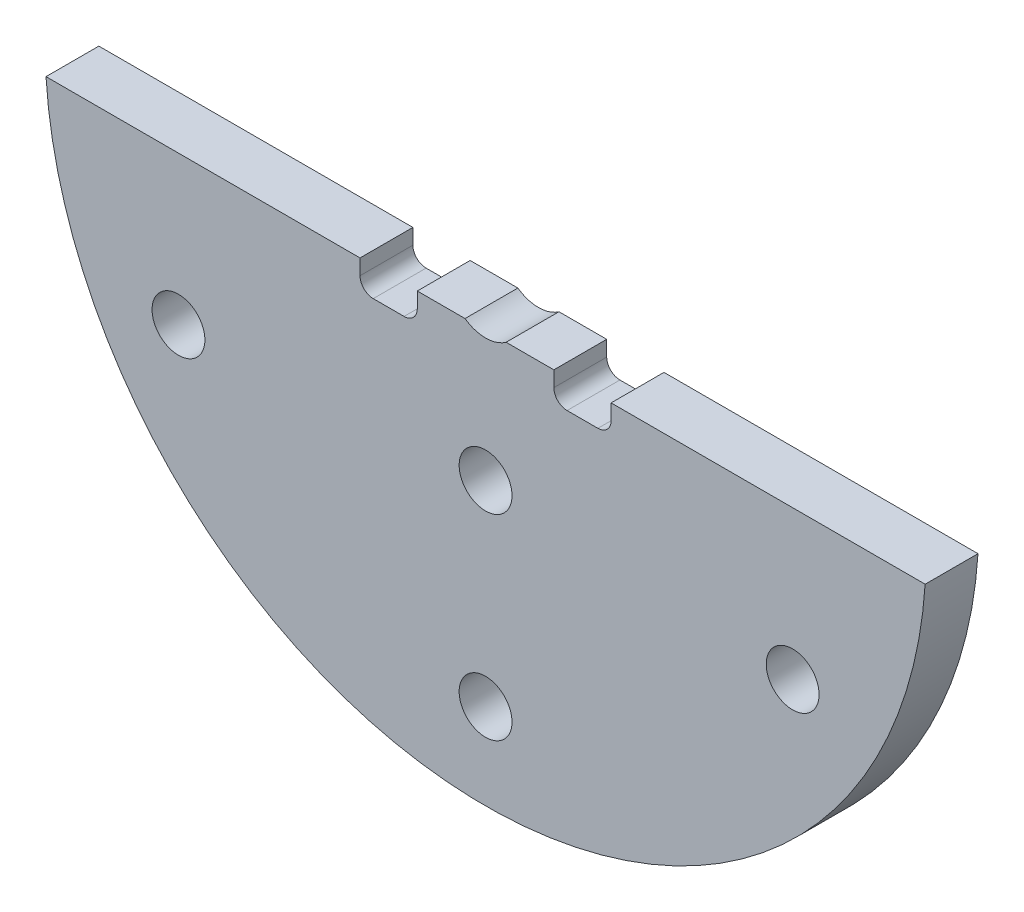
ISO-10303-21;
HEADER;
FILE_DESCRIPTION(('STEP AP214'),'2;1');
FILE_NAME('part.step','',(''),(''),'','','');
FILE_SCHEMA(('AUTOMOTIVE_DESIGN { 1 0 10303 214 1 1 1 1 }'));
ENDSEC;
DATA;
#1=APPLICATION_CONTEXT('core data for automotive mechanical design processes');
#2=APPLICATION_PROTOCOL_DEFINITION('international standard','automotive_design',2000,#1);
#3=PRODUCT_CONTEXT('',#1,'mechanical');
#4=PRODUCT('Part','Part','',(#3));
#5=PRODUCT_RELATED_PRODUCT_CATEGORY('part','',(#4));
#6=PRODUCT_DEFINITION_FORMATION('','',#4);
#7=PRODUCT_DEFINITION_CONTEXT('part definition',#1,'design');
#8=PRODUCT_DEFINITION('design','',#6,#7);
#9=PRODUCT_DEFINITION_SHAPE('','',#8);
#10=(LENGTH_UNIT() NAMED_UNIT(*) SI_UNIT(.MILLI.,.METRE.));
#11=(NAMED_UNIT(*) PLANE_ANGLE_UNIT() SI_UNIT($,.RADIAN.));
#12=(NAMED_UNIT(*) SI_UNIT($,.STERADIAN.) SOLID_ANGLE_UNIT());
#13=UNCERTAINTY_MEASURE_WITH_UNIT(LENGTH_MEASURE(1.E-05),#10,'distance_accuracy_value','');
#14=(GEOMETRIC_REPRESENTATION_CONTEXT(3) GLOBAL_UNCERTAINTY_ASSIGNED_CONTEXT((#13)) GLOBAL_UNIT_ASSIGNED_CONTEXT((#10,
#11,#12)) REPRESENTATION_CONTEXT('',''));
#15=CARTESIAN_POINT('',(0.,0.,0.));
#16=DIRECTION('',(0.,0.,1.));
#17=DIRECTION('',(1.,0.,0.));
#18=AXIS2_PLACEMENT_3D('',#15,#16,#17);
#19=CARTESIAN_POINT('',(190.230949351342,190.589281636706,3.));
#20=DIRECTION('',(0.,0.,1.));
#21=DIRECTION('',(1.,0.,0.));
#22=AXIS2_PLACEMENT_3D('',#19,#20,#21);
#23=PLANE('',#22);
#24=CARTESIAN_POINT('',(207.6593744092,180.5269757379,3.));
#25=DIRECTION('',(0.,0.,1.));
#26=DIRECTION('',(1.,0.,0.));
#27=AXIS2_PLACEMENT_3D('',#24,#25,#26);
#28=CIRCLE('',#27,1.5);
#29=CARTESIAN_POINT('',(209.1593744092,180.5269757379,3.));
#30=VERTEX_POINT('',#29);
#31=EDGE_CURVE('E517',#30,#30,#28,.T.);
#32=ORIENTED_EDGE('',*,*,#31,.F.);
#33=EDGE_LOOP('',(#32));
#34=FACE_BOUND('',#33,.T.);
#35=CARTESIAN_POINT('',(172.8025242934,180.5269757379,3.));
#36=DIRECTION('',(0.,0.,1.));
#37=DIRECTION('',(1.,0.,0.));
#38=AXIS2_PLACEMENT_3D('',#35,#36,#37);
#39=CIRCLE('',#38,1.5);
#40=CARTESIAN_POINT('',(174.3025242934,180.5269757379,3.));
#41=VERTEX_POINT('',#40);
#42=EDGE_CURVE('E180',#41,#41,#39,.T.);
#43=ORIENTED_EDGE('',*,*,#42,.F.);
#44=EDGE_LOOP('',(#43));
#45=FACE_BOUND('',#44,.T.);
#46=CARTESIAN_POINT('',(190.230949351342,190.589281636706,3.));
#47=DIRECTION('',(0.,0.,1.));
#48=DIRECTION('',(1.,0.,0.));
#49=AXIS2_PLACEMENT_3D('',#46,#47,#48);
#50=CIRCLE('',#49,25.);
#51=CARTESIAN_POINT('',(165.2838177527,188.9642816367,3.));
#52=VERTEX_POINT('',#51);
#53=CARTESIAN_POINT('',(215.1780809499,188.9642816367,3.));
#54=VERTEX_POINT('',#53);
#55=EDGE_CURVE('E116',#52,#54,#50,.T.);
#56=ORIENTED_EDGE('',*,*,#55,.T.);
#57=DIRECTION('',(-1.,0.,0.));
#58=VECTOR('',#57,1.);
#59=CARTESIAN_POINT('',(197.3559493513,188.9642816367,3.));
#60=LINE('',#59,#58);
#61=CARTESIAN_POINT('',(197.3559493513,188.9642816367,3.));
#62=VERTEX_POINT('',#61);
#63=EDGE_CURVE('E297',#54,#62,#60,.T.);
#64=ORIENTED_EDGE('',*,*,#63,.T.);
#65=DIRECTION('',(0.,-1.,0.));
#66=VECTOR('',#65,1.);
#67=CARTESIAN_POINT('',(197.3559493513,188.0892816367,3.));
#68=LINE('',#67,#66);
#69=CARTESIAN_POINT('',(197.3559493513,188.0892816367,3.));
#70=VERTEX_POINT('',#69);
#71=EDGE_CURVE('E248',#62,#70,#68,.T.);
#72=ORIENTED_EDGE('',*,*,#71,.T.);
#73=CARTESIAN_POINT('',(196.6059493513,188.0892816367,3.));
#74=DIRECTION('',(0.,0.,-1.));
#75=DIRECTION('',(1.,0.,0.));
#76=AXIS2_PLACEMENT_3D('',#73,#74,#75);
#77=CIRCLE('',#76,0.750000000000237);
#78=CARTESIAN_POINT('',(196.6059493513,187.3392816367,3.));
#79=VERTEX_POINT('',#78);
#80=EDGE_CURVE('E267',#70,#79,#77,.T.);
#81=ORIENTED_EDGE('',*,*,#80,.T.);
#82=DIRECTION('',(-1.,0.,0.));
#83=VECTOR('',#82,1.);
#84=CARTESIAN_POINT('',(194.8559493513,187.3392816367,3.));
#85=LINE('',#84,#83);
#86=CARTESIAN_POINT('',(194.8559493513,187.3392816367,3.));
#87=VERTEX_POINT('',#86);
#88=EDGE_CURVE('E264',#79,#87,#85,.T.);
#89=ORIENTED_EDGE('',*,*,#88,.T.);
#90=CARTESIAN_POINT('',(194.8559493513,188.0892816367,3.));
#91=DIRECTION('',(0.,0.,-1.));
#92=DIRECTION('',(1.,0.,0.));
#93=AXIS2_PLACEMENT_3D('',#90,#91,#92);
#94=CIRCLE('',#93,0.750000000000001);
#95=CARTESIAN_POINT('',(194.1059493513,188.0892816367,3.));
#96=VERTEX_POINT('',#95);
#97=EDGE_CURVE('E266',#87,#96,#94,.T.);
#98=ORIENTED_EDGE('',*,*,#97,.T.);
#99=DIRECTION('',(0.,1.,0.));
#100=VECTOR('',#99,1.);
#101=CARTESIAN_POINT('',(194.1059493513,188.9642816367,3.));
#102=LINE('',#101,#100);
#103=CARTESIAN_POINT('',(194.1059493513,188.9642816367,3.));
#104=VERTEX_POINT('',#103);
#105=EDGE_CURVE('E269',#96,#104,#102,.T.);
#106=ORIENTED_EDGE('',*,*,#105,.T.);
#107=DIRECTION('',(-1.,0.,0.));
#108=VECTOR('',#107,1.);
#109=CARTESIAN_POINT('',(191.3968717329,188.9642816367,3.));
#110=LINE('',#109,#108);
#111=CARTESIAN_POINT('',(191.396871732914,188.96428163668,3.));
#112=VERTEX_POINT('',#111);
#113=EDGE_CURVE('E275',#104,#112,#110,.T.);
#114=ORIENTED_EDGE('',*,*,#113,.T.);
#115=CARTESIAN_POINT('',(190.230949351342,190.589281636706,3.));
#116=DIRECTION('',(0.,0.,-1.));
#117=DIRECTION('',(1.,0.,0.));
#118=AXIS2_PLACEMENT_3D('',#115,#116,#117);
#119=CIRCLE('',#118,1.99999999998351);
#120=CARTESIAN_POINT('',(189.0650269697,188.9642816367,3.));
#121=VERTEX_POINT('',#120);
#122=EDGE_CURVE('E277',#112,#121,#119,.T.);
#123=ORIENTED_EDGE('',*,*,#122,.T.);
#124=DIRECTION('',(-1.,0.,0.));
#125=VECTOR('',#124,1.);
#126=CARTESIAN_POINT('',(186.3559493513,188.9642816367,3.));
#127=LINE('',#126,#125);
#128=CARTESIAN_POINT('',(186.3559493513,188.9642816367,3.));
#129=VERTEX_POINT('',#128);
#130=EDGE_CURVE('E279',#121,#129,#127,.T.);
#131=ORIENTED_EDGE('',*,*,#130,.T.);
#132=DIRECTION('',(0.,-1.,0.));
#133=VECTOR('',#132,1.);
#134=CARTESIAN_POINT('',(186.3559493513,188.9642816367,3.));
#135=LINE('',#134,#133);
#136=CARTESIAN_POINT('',(186.3559493513,188.0892816367,3.));
#137=VERTEX_POINT('',#136);
#138=EDGE_CURVE('E281',#129,#137,#135,.T.);
#139=ORIENTED_EDGE('',*,*,#138,.T.);
#140=CARTESIAN_POINT('',(185.6059493513,188.0892816367,3.));
#141=DIRECTION('',(0.,0.,-1.));
#142=DIRECTION('',(1.,0.,0.));
#143=AXIS2_PLACEMENT_3D('',#140,#141,#142);
#144=CIRCLE('',#143,0.750000000000001);
#145=CARTESIAN_POINT('',(185.6059493513,187.3392816367,3.));
#146=VERTEX_POINT('',#145);
#147=EDGE_CURVE('E283',#137,#146,#144,.T.);
#148=ORIENTED_EDGE('',*,*,#147,.T.);
#149=DIRECTION('',(-1.,0.,0.));
#150=VECTOR('',#149,1.);
#151=CARTESIAN_POINT('',(185.6059493513,187.3392816367,3.));
#152=LINE('',#151,#150);
#153=CARTESIAN_POINT('',(183.8559493513,187.3392816367,3.));
#154=VERTEX_POINT('',#153);
#155=EDGE_CURVE('E160',#146,#154,#152,.T.);
#156=ORIENTED_EDGE('',*,*,#155,.T.);
#157=CARTESIAN_POINT('',(183.8559493513,188.0892816367,3.));
#158=DIRECTION('',(0.,0.,-1.));
#159=DIRECTION('',(1.,0.,0.));
#160=AXIS2_PLACEMENT_3D('',#157,#158,#159);
#161=CIRCLE('',#160,0.750000000000001);
#162=CARTESIAN_POINT('',(183.1059493513,188.0892816367,3.));
#163=VERTEX_POINT('',#162);
#164=EDGE_CURVE('E154',#154,#163,#161,.T.);
#165=ORIENTED_EDGE('',*,*,#164,.T.);
#166=DIRECTION('',(0.,1.,0.));
#167=VECTOR('',#166,1.);
#168=CARTESIAN_POINT('',(183.1059493513,188.0892816367,3.));
#169=LINE('',#168,#167);
#170=CARTESIAN_POINT('',(183.1059493513,188.9642816367,3.));
#171=VERTEX_POINT('',#170);
#172=EDGE_CURVE('E158',#163,#171,#169,.T.);
#173=ORIENTED_EDGE('',*,*,#172,.T.);
#174=DIRECTION('',(-1.,0.,0.));
#175=VECTOR('',#174,1.);
#176=CARTESIAN_POINT('',(165.2838177527,188.9642816367,3.));
#177=LINE('',#176,#175);
#178=EDGE_CURVE('E50',#171,#52,#177,.T.);
#179=ORIENTED_EDGE('',*,*,#178,.T.);
#180=EDGE_LOOP('',(#56,#64,#72,#81,#89,#98,#106,#114,#123,#131,#139,#148,#156,#165,#173,#179));
#181=FACE_BOUND('',#180,.T.);
#182=CARTESIAN_POINT('',(190.2309493513,170.4646698392,3.));
#183=DIRECTION('',(0.,0.,1.));
#184=DIRECTION('',(1.,0.,0.));
#185=AXIS2_PLACEMENT_3D('',#182,#183,#184);
#186=CIRCLE('',#185,1.5);
#187=CARTESIAN_POINT('',(191.7309493513,170.4646698392,3.));
#188=VERTEX_POINT('',#187);
#189=EDGE_CURVE('E523',#188,#188,#186,.T.);
#190=ORIENTED_EDGE('',*,*,#189,.F.);
#191=EDGE_LOOP('',(#190));
#192=FACE_BOUND('',#191,.T.);
#193=CARTESIAN_POINT('',(190.2309493513,181.5892816367,3.));
#194=DIRECTION('',(0.,0.,1.));
#195=DIRECTION('',(1.,0.,0.));
#196=AXIS2_PLACEMENT_3D('',#193,#194,#195);
#197=CIRCLE('',#196,1.5);
#198=CARTESIAN_POINT('',(191.7309493513,181.5892816367,3.));
#199=VERTEX_POINT('',#198);
#200=EDGE_CURVE('E508',#199,#199,#197,.T.);
#201=ORIENTED_EDGE('',*,*,#200,.F.);
#202=EDGE_LOOP('',(#201));
#203=FACE_BOUND('',#202,.T.);
#204=ADVANCED_FACE('F33',(#34,#45,#181,#192,#203),#23,.T.);
#205=CARTESIAN_POINT('',(190.230949351342,190.589281636706,0.));
#206=DIRECTION('',(0.,0.,1.));
#207=DIRECTION('',(1.,0.,0.));
#208=AXIS2_PLACEMENT_3D('',#205,#206,#207);
#209=PLANE('',#208);
#210=CARTESIAN_POINT('',(207.6593744092,180.5269757379,0.));
#211=DIRECTION('',(0.,0.,1.));
#212=DIRECTION('',(1.,0.,0.));
#213=AXIS2_PLACEMENT_3D('',#210,#211,#212);
#214=CIRCLE('',#213,1.5);
#215=CARTESIAN_POINT('',(209.1593744092,180.5269757379,0.));
#216=VERTEX_POINT('',#215);
#217=EDGE_CURVE('E514',#216,#216,#214,.T.);
#218=ORIENTED_EDGE('',*,*,#217,.T.);
#219=EDGE_LOOP('',(#218));
#220=FACE_BOUND('',#219,.T.);
#221=CARTESIAN_POINT('',(172.8025242934,180.5269757379,0.));
#222=DIRECTION('',(0.,0.,1.));
#223=DIRECTION('',(1.,0.,0.));
#224=AXIS2_PLACEMENT_3D('',#221,#222,#223);
#225=CIRCLE('',#224,1.5);
#226=CARTESIAN_POINT('',(174.3025242934,180.5269757379,0.));
#227=VERTEX_POINT('',#226);
#228=EDGE_CURVE('E301',#227,#227,#225,.T.);
#229=ORIENTED_EDGE('',*,*,#228,.T.);
#230=EDGE_LOOP('',(#229));
#231=FACE_BOUND('',#230,.T.);
#232=CARTESIAN_POINT('',(190.230949351342,190.589281636706,0.));
#233=DIRECTION('',(0.,0.,1.));
#234=DIRECTION('',(1.,0.,0.));
#235=AXIS2_PLACEMENT_3D('',#232,#233,#234);
#236=CIRCLE('',#235,24.9999999999577);
#237=CARTESIAN_POINT('',(165.2838177527,188.9642816367,0.));
#238=VERTEX_POINT('',#237);
#239=CARTESIAN_POINT('',(215.1780809499,188.9642816367,0.));
#240=VERTEX_POINT('',#239);
#241=EDGE_CURVE('E110',#238,#240,#236,.T.);
#242=ORIENTED_EDGE('',*,*,#241,.F.);
#243=DIRECTION('',(-1.,0.,0.));
#244=VECTOR('',#243,1.);
#245=CARTESIAN_POINT('',(165.2838177527,188.9642816367,0.));
#246=LINE('',#245,#244);
#247=CARTESIAN_POINT('',(183.1059493513,188.9642816367,0.));
#248=VERTEX_POINT('',#247);
#249=EDGE_CURVE('E206',#248,#238,#246,.T.);
#250=ORIENTED_EDGE('',*,*,#249,.F.);
#251=DIRECTION('',(0.,1.,0.));
#252=VECTOR('',#251,1.);
#253=CARTESIAN_POINT('',(183.1059493513,188.0892816367,0.));
#254=LINE('',#253,#252);
#255=CARTESIAN_POINT('',(183.1059493513,188.0892816367,0.));
#256=VERTEX_POINT('',#255);
#257=EDGE_CURVE('E103',#256,#248,#254,.T.);
#258=ORIENTED_EDGE('',*,*,#257,.F.);
#259=CARTESIAN_POINT('',(183.8559493513,188.0892816367,0.));
#260=DIRECTION('',(0.,0.,-1.));
#261=DIRECTION('',(1.,0.,0.));
#262=AXIS2_PLACEMENT_3D('',#259,#260,#261);
#263=CIRCLE('',#262,0.750000000000001);
#264=CARTESIAN_POINT('',(183.8559493513,187.3392816367,0.));
#265=VERTEX_POINT('',#264);
#266=EDGE_CURVE('E168',#265,#256,#263,.T.);
#267=ORIENTED_EDGE('',*,*,#266,.F.);
#268=DIRECTION('',(-1.,0.,0.));
#269=VECTOR('',#268,1.);
#270=CARTESIAN_POINT('',(185.6059493513,187.3392816367,0.));
#271=LINE('',#270,#269);
#272=CARTESIAN_POINT('',(185.6059493513,187.3392816367,0.));
#273=VERTEX_POINT('',#272);
#274=EDGE_CURVE('E202',#273,#265,#271,.T.);
#275=ORIENTED_EDGE('',*,*,#274,.F.);
#276=CARTESIAN_POINT('',(185.6059493513,188.0892816367,0.));
#277=DIRECTION('',(0.,0.,-1.));
#278=DIRECTION('',(1.,0.,0.));
#279=AXIS2_PLACEMENT_3D('',#276,#277,#278);
#280=CIRCLE('',#279,0.750000000000001);
#281=CARTESIAN_POINT('',(186.3559493513,188.0892816367,0.));
#282=VERTEX_POINT('',#281);
#283=EDGE_CURVE('E200',#282,#273,#280,.T.);
#284=ORIENTED_EDGE('',*,*,#283,.F.);
#285=DIRECTION('',(0.,-1.,0.));
#286=VECTOR('',#285,1.);
#287=CARTESIAN_POINT('',(186.3559493513,188.9642816367,0.));
#288=LINE('',#287,#286);
#289=CARTESIAN_POINT('',(186.3559493513,188.9642816367,0.));
#290=VERTEX_POINT('',#289);
#291=EDGE_CURVE('E198',#290,#282,#288,.T.);
#292=ORIENTED_EDGE('',*,*,#291,.F.);
#293=DIRECTION('',(-1.,0.,0.));
#294=VECTOR('',#293,1.);
#295=CARTESIAN_POINT('',(186.3559493513,188.9642816367,0.));
#296=LINE('',#295,#294);
#297=CARTESIAN_POINT('',(189.0650269697,188.9642816367,0.));
#298=VERTEX_POINT('',#297);
#299=EDGE_CURVE('E196',#298,#290,#296,.T.);
#300=ORIENTED_EDGE('',*,*,#299,.F.);
#301=CARTESIAN_POINT('',(190.230949351342,190.589281636706,0.));
#302=DIRECTION('',(0.,0.,-1.));
#303=DIRECTION('',(1.,0.,0.));
#304=AXIS2_PLACEMENT_3D('',#301,#302,#303);
#305=CIRCLE('',#304,1.99999999998351);
#306=CARTESIAN_POINT('',(191.396871732914,188.96428163668,0.));
#307=VERTEX_POINT('',#306);
#308=EDGE_CURVE('E194',#307,#298,#305,.T.);
#309=ORIENTED_EDGE('',*,*,#308,.F.);
#310=DIRECTION('',(-1.,0.,0.));
#311=VECTOR('',#310,1.);
#312=CARTESIAN_POINT('',(191.3968717329,188.9642816367,0.));
#313=LINE('',#312,#311);
#314=CARTESIAN_POINT('',(194.1059493513,188.9642816367,0.));
#315=VERTEX_POINT('',#314);
#316=EDGE_CURVE('E192',#315,#307,#313,.T.);
#317=ORIENTED_EDGE('',*,*,#316,.F.);
#318=DIRECTION('',(0.,1.,0.));
#319=VECTOR('',#318,1.);
#320=CARTESIAN_POINT('',(194.1059493513,188.9642816367,0.));
#321=LINE('',#320,#319);
#322=CARTESIAN_POINT('',(194.1059493513,188.0892816367,0.));
#323=VERTEX_POINT('',#322);
#324=EDGE_CURVE('E190',#323,#315,#321,.T.);
#325=ORIENTED_EDGE('',*,*,#324,.F.);
#326=CARTESIAN_POINT('',(194.8559493513,188.0892816367,0.));
#327=DIRECTION('',(0.,0.,-1.));
#328=DIRECTION('',(1.,0.,0.));
#329=AXIS2_PLACEMENT_3D('',#326,#327,#328);
#330=CIRCLE('',#329,0.750000000000001);
#331=CARTESIAN_POINT('',(194.8559493513,187.3392816367,0.));
#332=VERTEX_POINT('',#331);
#333=EDGE_CURVE('E188',#332,#323,#330,.T.);
#334=ORIENTED_EDGE('',*,*,#333,.F.);
#335=DIRECTION('',(-1.,0.,0.));
#336=VECTOR('',#335,1.);
#337=CARTESIAN_POINT('',(194.8559493513,187.3392816367,0.));
#338=LINE('',#337,#336);
#339=CARTESIAN_POINT('',(196.6059493513,187.3392816367,0.));
#340=VERTEX_POINT('',#339);
#341=EDGE_CURVE('E186',#340,#332,#338,.T.);
#342=ORIENTED_EDGE('',*,*,#341,.F.);
#343=CARTESIAN_POINT('',(196.6059493513,188.0892816367,0.));
#344=DIRECTION('',(0.,0.,-1.));
#345=DIRECTION('',(1.,0.,0.));
#346=AXIS2_PLACEMENT_3D('',#343,#344,#345);
#347=CIRCLE('',#346,0.750000000000237);
#348=CARTESIAN_POINT('',(197.3559493513,188.0892816367,0.));
#349=VERTEX_POINT('',#348);
#350=EDGE_CURVE('E184',#349,#340,#347,.T.);
#351=ORIENTED_EDGE('',*,*,#350,.F.);
#352=DIRECTION('',(0.,-1.,0.));
#353=VECTOR('',#352,1.);
#354=CARTESIAN_POINT('',(197.3559493513,188.0892816367,0.));
#355=LINE('',#354,#353);
#356=CARTESIAN_POINT('',(197.3559493513,188.9642816367,0.));
#357=VERTEX_POINT('',#356);
#358=EDGE_CURVE('E182',#357,#349,#355,.T.);
#359=ORIENTED_EDGE('',*,*,#358,.F.);
#360=DIRECTION('',(-1.,0.,0.));
#361=VECTOR('',#360,1.);
#362=CARTESIAN_POINT('',(197.3559493513,188.9642816367,0.));
#363=LINE('',#362,#361);
#364=EDGE_CURVE('E179',#240,#357,#363,.T.);
#365=ORIENTED_EDGE('',*,*,#364,.F.);
#366=EDGE_LOOP('',(#242,#250,#258,#267,#275,#284,#292,#300,#309,#317,#325,#334,#342,#351,#359,#365));
#367=FACE_BOUND('',#366,.T.);
#368=CARTESIAN_POINT('',(190.2309493513,170.4646698392,0.));
#369=DIRECTION('',(0.,0.,1.));
#370=DIRECTION('',(1.,0.,0.));
#371=AXIS2_PLACEMENT_3D('',#368,#369,#370);
#372=CIRCLE('',#371,1.5);
#373=CARTESIAN_POINT('',(191.7309493513,170.4646698392,0.));
#374=VERTEX_POINT('',#373);
#375=EDGE_CURVE('E520',#374,#374,#372,.T.);
#376=ORIENTED_EDGE('',*,*,#375,.T.);
#377=EDGE_LOOP('',(#376));
#378=FACE_BOUND('',#377,.T.);
#379=CARTESIAN_POINT('',(190.2309493513,181.5892816367,0.));
#380=DIRECTION('',(0.,0.,1.));
#381=DIRECTION('',(1.,0.,0.));
#382=AXIS2_PLACEMENT_3D('',#379,#380,#381);
#383=CIRCLE('',#382,1.5);
#384=CARTESIAN_POINT('',(191.7309493513,181.5892816367,0.));
#385=VERTEX_POINT('',#384);
#386=EDGE_CURVE('E511',#385,#385,#383,.T.);
#387=ORIENTED_EDGE('',*,*,#386,.T.);
#388=EDGE_LOOP('',(#387));
#389=FACE_BOUND('',#388,.T.);
#390=ADVANCED_FACE('F252',(#220,#231,#367,#378,#389),#209,.F.);
#391=CARTESIAN_POINT('',(190.230949351342,190.589281636706,3.));
#392=DIRECTION('',(0.,0.,-1.));
#393=DIRECTION('',(-1.,0.,0.));
#394=AXIS2_PLACEMENT_3D('',#391,#392,#393);
#395=CYLINDRICAL_SURFACE('',#394,24.9999999999577);
#396=ORIENTED_EDGE('',*,*,#241,.T.);
#397=DIRECTION('',(0.,0.,-1.));
#398=VECTOR('',#397,1.);
#399=CARTESIAN_POINT('',(215.1780809499,188.9642816367,3.));
#400=LINE('',#399,#398);
#401=EDGE_CURVE('E11',#54,#240,#400,.T.);
#402=ORIENTED_EDGE('',*,*,#401,.F.);
#403=ORIENTED_EDGE('',*,*,#55,.F.);
#404=DIRECTION('',(0.,0.,-1.));
#405=VECTOR('',#404,1.);
#406=CARTESIAN_POINT('',(165.2838177527,188.9642816367,3.));
#407=LINE('',#406,#405);
#408=EDGE_CURVE('E174',#52,#238,#407,.T.);
#409=ORIENTED_EDGE('',*,*,#408,.T.);
#410=EDGE_LOOP('',(#396,#402,#403,#409));
#411=FACE_BOUND('',#410,.T.);
#412=ADVANCED_FACE('F35',(#411),#395,.T.);
#413=CARTESIAN_POINT('',(197.3559493513,188.9642816367,3.));
#414=DIRECTION('',(0.,-1.,0.));
#415=DIRECTION('',(0.,0.,-1.));
#416=AXIS2_PLACEMENT_3D('',#413,#414,#415);
#417=PLANE('',#416);
#418=ORIENTED_EDGE('',*,*,#364,.T.);
#419=DIRECTION('',(0.,0.,-1.));
#420=VECTOR('',#419,1.);
#421=CARTESIAN_POINT('',(197.3559493513,188.9642816367,3.));
#422=LINE('',#421,#420);
#423=EDGE_CURVE('E42',#62,#357,#422,.T.);
#424=ORIENTED_EDGE('',*,*,#423,.F.);
#425=ORIENTED_EDGE('',*,*,#63,.F.);
#426=ORIENTED_EDGE('',*,*,#401,.T.);
#427=EDGE_LOOP('',(#418,#424,#425,#426));
#428=FACE_BOUND('',#427,.T.);
#429=ADVANCED_FACE('F303',(#428),#417,.F.);
#430=CARTESIAN_POINT('',(197.3559493513,188.0892816367,3.));
#431=DIRECTION('',(1.,0.,0.));
#432=DIRECTION('',(0.,0.,-1.));
#433=AXIS2_PLACEMENT_3D('',#430,#431,#432);
#434=PLANE('',#433);
#435=ORIENTED_EDGE('',*,*,#358,.T.);
#436=DIRECTION('',(0.,0.,-1.));
#437=VECTOR('',#436,1.);
#438=CARTESIAN_POINT('',(197.3559493513,188.0892816367,3.));
#439=LINE('',#438,#437);
#440=EDGE_CURVE('E239',#70,#349,#439,.T.);
#441=ORIENTED_EDGE('',*,*,#440,.F.);
#442=ORIENTED_EDGE('',*,*,#71,.F.);
#443=ORIENTED_EDGE('',*,*,#423,.T.);
#444=EDGE_LOOP('',(#435,#441,#442,#443));
#445=FACE_BOUND('',#444,.T.);
#446=ADVANCED_FACE('F246',(#445),#434,.F.);
#447=CARTESIAN_POINT('',(196.6059493513,188.0892816367,3.));
#448=DIRECTION('',(0.,0.,-1.));
#449=DIRECTION('',(-1.,0.,0.));
#450=AXIS2_PLACEMENT_3D('',#447,#448,#449);
#451=CYLINDRICAL_SURFACE('',#450,0.750000000000237);
#452=ORIENTED_EDGE('',*,*,#350,.T.);
#453=DIRECTION('',(0.,0.,-1.));
#454=VECTOR('',#453,1.);
#455=CARTESIAN_POINT('',(196.6059493513,187.3392816367,3.));
#456=LINE('',#455,#454);
#457=EDGE_CURVE('E236',#79,#340,#456,.T.);
#458=ORIENTED_EDGE('',*,*,#457,.F.);
#459=ORIENTED_EDGE('',*,*,#80,.F.);
#460=ORIENTED_EDGE('',*,*,#440,.T.);
#461=EDGE_LOOP('',(#452,#458,#459,#460));
#462=FACE_BOUND('',#461,.T.);
#463=ADVANCED_FACE('F258',(#462),#451,.F.);
#464=CARTESIAN_POINT('',(194.8559493513,187.3392816367,3.));
#465=DIRECTION('',(0.,-1.,0.));
#466=DIRECTION('',(0.,0.,-1.));
#467=AXIS2_PLACEMENT_3D('',#464,#465,#466);
#468=PLANE('',#467);
#469=ORIENTED_EDGE('',*,*,#341,.T.);
#470=DIRECTION('',(0.,0.,-1.));
#471=VECTOR('',#470,1.);
#472=CARTESIAN_POINT('',(194.8559493513,187.3392816367,3.));
#473=LINE('',#472,#471);
#474=EDGE_CURVE('E233',#87,#332,#473,.T.);
#475=ORIENTED_EDGE('',*,*,#474,.F.);
#476=ORIENTED_EDGE('',*,*,#88,.F.);
#477=ORIENTED_EDGE('',*,*,#457,.T.);
#478=EDGE_LOOP('',(#469,#475,#476,#477));
#479=FACE_BOUND('',#478,.T.);
#480=ADVANCED_FACE('F262',(#479),#468,.F.);
#481=CARTESIAN_POINT('',(194.8559493513,188.0892816367,3.));
#482=DIRECTION('',(0.,0.,-1.));
#483=DIRECTION('',(-1.,0.,0.));
#484=AXIS2_PLACEMENT_3D('',#481,#482,#483);
#485=CYLINDRICAL_SURFACE('',#484,0.750000000000001);
#486=ORIENTED_EDGE('',*,*,#333,.T.);
#487=DIRECTION('',(0.,0.,-1.));
#488=VECTOR('',#487,1.);
#489=CARTESIAN_POINT('',(194.1059493513,188.0892816367,3.));
#490=LINE('',#489,#488);
#491=EDGE_CURVE('E230',#96,#323,#490,.T.);
#492=ORIENTED_EDGE('',*,*,#491,.F.);
#493=ORIENTED_EDGE('',*,*,#97,.F.);
#494=ORIENTED_EDGE('',*,*,#474,.T.);
#495=EDGE_LOOP('',(#486,#492,#493,#494));
#496=FACE_BOUND('',#495,.T.);
#497=ADVANCED_FACE('F353',(#496),#485,.F.);
#498=CARTESIAN_POINT('',(194.1059493513,188.9642816367,3.));
#499=DIRECTION('',(-1.,0.,0.));
#500=DIRECTION('',(0.,0.,1.));
#501=AXIS2_PLACEMENT_3D('',#498,#499,#500);
#502=PLANE('',#501);
#503=ORIENTED_EDGE('',*,*,#324,.T.);
#504=DIRECTION('',(0.,0.,-1.));
#505=VECTOR('',#504,1.);
#506=CARTESIAN_POINT('',(194.1059493513,188.9642816367,3.));
#507=LINE('',#506,#505);
#508=EDGE_CURVE('E227',#104,#315,#507,.T.);
#509=ORIENTED_EDGE('',*,*,#508,.F.);
#510=ORIENTED_EDGE('',*,*,#105,.F.);
#511=ORIENTED_EDGE('',*,*,#491,.T.);
#512=EDGE_LOOP('',(#503,#509,#510,#511));
#513=FACE_BOUND('',#512,.T.);
#514=ADVANCED_FACE('F349',(#513),#502,.F.);
#515=CARTESIAN_POINT('',(191.3968717329,188.9642816367,3.));
#516=DIRECTION('',(0.,-1.,0.));
#517=DIRECTION('',(0.,0.,-1.));
#518=AXIS2_PLACEMENT_3D('',#515,#516,#517);
#519=PLANE('',#518);
#520=ORIENTED_EDGE('',*,*,#316,.T.);
#521=DIRECTION('',(0.,0.,-1.));
#522=VECTOR('',#521,1.);
#523=CARTESIAN_POINT('',(191.396871732914,188.96428163668,3.));
#524=LINE('',#523,#522);
#525=EDGE_CURVE('E224',#112,#307,#524,.T.);
#526=ORIENTED_EDGE('',*,*,#525,.F.);
#527=ORIENTED_EDGE('',*,*,#113,.F.);
#528=ORIENTED_EDGE('',*,*,#508,.T.);
#529=EDGE_LOOP('',(#520,#526,#527,#528));
#530=FACE_BOUND('',#529,.T.);
#531=ADVANCED_FACE('F345',(#530),#519,.F.);
#532=CARTESIAN_POINT('',(190.230949351342,190.589281636706,3.));
#533=DIRECTION('',(0.,0.,-1.));
#534=DIRECTION('',(-1.,0.,0.));
#535=AXIS2_PLACEMENT_3D('',#532,#533,#534);
#536=CYLINDRICAL_SURFACE('',#535,1.99999999998351);
#537=ORIENTED_EDGE('',*,*,#308,.T.);
#538=DIRECTION('',(0.,0.,-1.));
#539=VECTOR('',#538,1.);
#540=CARTESIAN_POINT('',(189.0650269697,188.9642816367,3.));
#541=LINE('',#540,#539);
#542=EDGE_CURVE('E221',#121,#298,#541,.T.);
#543=ORIENTED_EDGE('',*,*,#542,.F.);
#544=ORIENTED_EDGE('',*,*,#122,.F.);
#545=ORIENTED_EDGE('',*,*,#525,.T.);
#546=EDGE_LOOP('',(#537,#543,#544,#545));
#547=FACE_BOUND('',#546,.T.);
#548=ADVANCED_FACE('F341',(#547),#536,.F.);
#549=CARTESIAN_POINT('',(186.3559493513,188.9642816367,3.));
#550=DIRECTION('',(0.,-1.,0.));
#551=DIRECTION('',(0.,0.,-1.));
#552=AXIS2_PLACEMENT_3D('',#549,#550,#551);
#553=PLANE('',#552);
#554=ORIENTED_EDGE('',*,*,#299,.T.);
#555=DIRECTION('',(0.,0.,-1.));
#556=VECTOR('',#555,1.);
#557=CARTESIAN_POINT('',(186.3559493513,188.9642816367,3.));
#558=LINE('',#557,#556);
#559=EDGE_CURVE('E218',#129,#290,#558,.T.);
#560=ORIENTED_EDGE('',*,*,#559,.F.);
#561=ORIENTED_EDGE('',*,*,#130,.F.);
#562=ORIENTED_EDGE('',*,*,#542,.T.);
#563=EDGE_LOOP('',(#554,#560,#561,#562));
#564=FACE_BOUND('',#563,.T.);
#565=ADVANCED_FACE('F337',(#564),#553,.F.);
#566=CARTESIAN_POINT('',(186.3559493513,188.9642816367,3.));
#567=DIRECTION('',(1.,0.,0.));
#568=DIRECTION('',(0.,0.,-1.));
#569=AXIS2_PLACEMENT_3D('',#566,#567,#568);
#570=PLANE('',#569);
#571=ORIENTED_EDGE('',*,*,#291,.T.);
#572=DIRECTION('',(0.,0.,-1.));
#573=VECTOR('',#572,1.);
#574=CARTESIAN_POINT('',(186.3559493513,188.0892816367,3.));
#575=LINE('',#574,#573);
#576=EDGE_CURVE('E215',#137,#282,#575,.T.);
#577=ORIENTED_EDGE('',*,*,#576,.F.);
#578=ORIENTED_EDGE('',*,*,#138,.F.);
#579=ORIENTED_EDGE('',*,*,#559,.T.);
#580=EDGE_LOOP('',(#571,#577,#578,#579));
#581=FACE_BOUND('',#580,.T.);
#582=ADVANCED_FACE('F334',(#581),#570,.F.);
#583=CARTESIAN_POINT('',(185.6059493513,188.0892816367,3.));
#584=DIRECTION('',(0.,0.,-1.));
#585=DIRECTION('',(-1.,0.,0.));
#586=AXIS2_PLACEMENT_3D('',#583,#584,#585);
#587=CYLINDRICAL_SURFACE('',#586,0.750000000000001);
#588=ORIENTED_EDGE('',*,*,#283,.T.);
#589=DIRECTION('',(0.,0.,-1.));
#590=VECTOR('',#589,1.);
#591=CARTESIAN_POINT('',(185.6059493513,187.3392816367,3.));
#592=LINE('',#591,#590);
#593=EDGE_CURVE('E212',#146,#273,#592,.T.);
#594=ORIENTED_EDGE('',*,*,#593,.F.);
#595=ORIENTED_EDGE('',*,*,#147,.F.);
#596=ORIENTED_EDGE('',*,*,#576,.T.);
#597=EDGE_LOOP('',(#588,#594,#595,#596));
#598=FACE_BOUND('',#597,.T.);
#599=ADVANCED_FACE('F289',(#598),#587,.F.);
#600=CARTESIAN_POINT('',(185.6059493513,187.3392816367,3.));
#601=DIRECTION('',(0.,-1.,0.));
#602=DIRECTION('',(0.,0.,-1.));
#603=AXIS2_PLACEMENT_3D('',#600,#601,#602);
#604=PLANE('',#603);
#605=ORIENTED_EDGE('',*,*,#274,.T.);
#606=DIRECTION('',(0.,0.,-1.));
#607=VECTOR('',#606,1.);
#608=CARTESIAN_POINT('',(183.8559493513,187.3392816367,3.));
#609=LINE('',#608,#607);
#610=EDGE_CURVE('E169',#154,#265,#609,.T.);
#611=ORIENTED_EDGE('',*,*,#610,.F.);
#612=ORIENTED_EDGE('',*,*,#155,.F.);
#613=ORIENTED_EDGE('',*,*,#593,.T.);
#614=EDGE_LOOP('',(#605,#611,#612,#613));
#615=FACE_BOUND('',#614,.T.);
#616=ADVANCED_FACE('F293',(#615),#604,.F.);
#617=CARTESIAN_POINT('',(183.8559493513,188.0892816367,3.));
#618=DIRECTION('',(0.,0.,-1.));
#619=DIRECTION('',(-1.,0.,0.));
#620=AXIS2_PLACEMENT_3D('',#617,#618,#619);
#621=CYLINDRICAL_SURFACE('',#620,0.750000000000001);
#622=ORIENTED_EDGE('',*,*,#266,.T.);
#623=DIRECTION('',(0.,0.,-1.));
#624=VECTOR('',#623,1.);
#625=CARTESIAN_POINT('',(183.1059493513,188.0892816367,3.));
#626=LINE('',#625,#624);
#627=EDGE_CURVE('E165',#163,#256,#626,.T.);
#628=ORIENTED_EDGE('',*,*,#627,.F.);
#629=ORIENTED_EDGE('',*,*,#164,.F.);
#630=ORIENTED_EDGE('',*,*,#610,.T.);
#631=EDGE_LOOP('',(#622,#628,#629,#630));
#632=FACE_BOUND('',#631,.T.);
#633=ADVANCED_FACE('F166',(#632),#621,.F.);
#634=CARTESIAN_POINT('',(183.1059493513,188.0892816367,3.));
#635=DIRECTION('',(-1.,0.,0.));
#636=DIRECTION('',(0.,0.,1.));
#637=AXIS2_PLACEMENT_3D('',#634,#635,#636);
#638=PLANE('',#637);
#639=ORIENTED_EDGE('',*,*,#257,.T.);
#640=DIRECTION('',(0.,0.,-1.));
#641=VECTOR('',#640,1.);
#642=CARTESIAN_POINT('',(183.1059493513,188.9642816367,3.));
#643=LINE('',#642,#641);
#644=EDGE_CURVE('E170',#171,#248,#643,.T.);
#645=ORIENTED_EDGE('',*,*,#644,.F.);
#646=ORIENTED_EDGE('',*,*,#172,.F.);
#647=ORIENTED_EDGE('',*,*,#627,.T.);
#648=EDGE_LOOP('',(#639,#645,#646,#647));
#649=FACE_BOUND('',#648,.T.);
#650=ADVANCED_FACE('F172',(#649),#638,.F.);
#651=CARTESIAN_POINT('',(165.2838177527,188.9642816367,3.));
#652=DIRECTION('',(0.,-1.,0.));
#653=DIRECTION('',(0.,0.,-1.));
#654=AXIS2_PLACEMENT_3D('',#651,#652,#653);
#655=PLANE('',#654);
#656=ORIENTED_EDGE('',*,*,#249,.T.);
#657=ORIENTED_EDGE('',*,*,#408,.F.);
#658=ORIENTED_EDGE('',*,*,#178,.F.);
#659=ORIENTED_EDGE('',*,*,#644,.T.);
#660=EDGE_LOOP('',(#656,#657,#658,#659));
#661=FACE_BOUND('',#660,.T.);
#662=ADVANCED_FACE('F295',(#661),#655,.F.);
#663=CARTESIAN_POINT('',(172.8025242934,180.5269757379,3.));
#664=DIRECTION('',(0.,0.,-1.));
#665=DIRECTION('',(-1.,0.,0.));
#666=AXIS2_PLACEMENT_3D('',#663,#664,#665);
#667=CYLINDRICAL_SURFACE('',#666,1.5);
#668=ORIENTED_EDGE('',*,*,#42,.T.);
#669=EDGE_LOOP('',(#668));
#670=FACE_BOUND('',#669,.T.);
#671=ORIENTED_EDGE('',*,*,#228,.F.);
#672=EDGE_LOOP('',(#671));
#673=FACE_BOUND('',#672,.T.);
#674=ADVANCED_FACE('F321',(#670,#673),#667,.F.);
#675=CARTESIAN_POINT('',(190.2309493513,170.4646698392,3.));
#676=DIRECTION('',(0.,0.,-1.));
#677=DIRECTION('',(-1.,0.,0.));
#678=AXIS2_PLACEMENT_3D('',#675,#676,#677);
#679=CYLINDRICAL_SURFACE('',#678,1.5);
#680=ORIENTED_EDGE('',*,*,#189,.T.);
#681=EDGE_LOOP('',(#680));
#682=FACE_BOUND('',#681,.T.);
#683=ORIENTED_EDGE('',*,*,#375,.F.);
#684=EDGE_LOOP('',(#683));
#685=FACE_BOUND('',#684,.T.);
#686=ADVANCED_FACE('F419',(#682,#685),#679,.F.);
#687=CARTESIAN_POINT('',(207.6593744092,180.5269757379,3.));
#688=DIRECTION('',(0.,0.,-1.));
#689=DIRECTION('',(-1.,0.,0.));
#690=AXIS2_PLACEMENT_3D('',#687,#688,#689);
#691=CYLINDRICAL_SURFACE('',#690,1.5);
#692=ORIENTED_EDGE('',*,*,#31,.T.);
#693=EDGE_LOOP('',(#692));
#694=FACE_BOUND('',#693,.T.);
#695=ORIENTED_EDGE('',*,*,#217,.F.);
#696=EDGE_LOOP('',(#695));
#697=FACE_BOUND('',#696,.T.);
#698=ADVANCED_FACE('F426',(#694,#697),#691,.F.);
#699=CARTESIAN_POINT('',(190.2309493513,181.5892816367,3.));
#700=DIRECTION('',(0.,0.,-1.));
#701=DIRECTION('',(-1.,0.,0.));
#702=AXIS2_PLACEMENT_3D('',#699,#700,#701);
#703=CYLINDRICAL_SURFACE('',#702,1.5);
#704=ORIENTED_EDGE('',*,*,#200,.T.);
#705=EDGE_LOOP('',(#704));
#706=FACE_BOUND('',#705,.T.);
#707=ORIENTED_EDGE('',*,*,#386,.F.);
#708=EDGE_LOOP('',(#707));
#709=FACE_BOUND('',#708,.T.);
#710=ADVANCED_FACE('F433',(#706,#709),#703,.F.);
#711=CLOSED_SHELL('',(#204,#390,#412,#429,#446,#463,#480,#497,#514,#531,#548,#565,#582,#599,
#616,#633,#650,#662,#674,#686,#698,#710));
#712=MANIFOLD_SOLID_BREP('B2',#711);
#713=ADVANCED_BREP_SHAPE_REPRESENTATION('',(#18,#712),#14);
#714=SHAPE_DEFINITION_REPRESENTATION(#9,#713);
ENDSEC;
END-ISO-10303-21;
